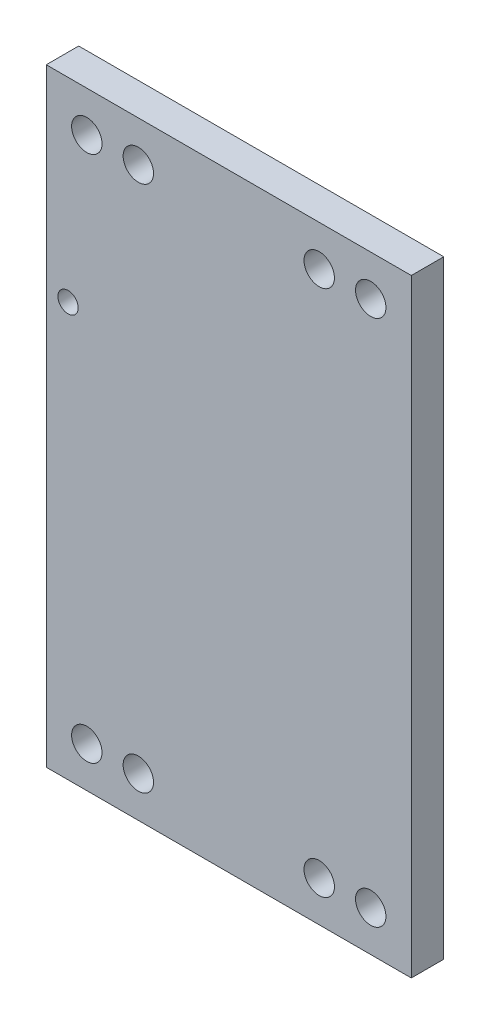
ISO-10303-21;
HEADER;
FILE_DESCRIPTION(('STEP AP214'),'2;1');
FILE_NAME('part.step','',(''),(''),'','','');
FILE_SCHEMA(('AUTOMOTIVE_DESIGN { 1 0 10303 214 1 1 1 1 }'));
ENDSEC;
DATA;
#1=APPLICATION_CONTEXT('core data for automotive mechanical design processes');
#2=APPLICATION_PROTOCOL_DEFINITION('international standard','automotive_design',2000,#1);
#3=PRODUCT_CONTEXT('',#1,'mechanical');
#4=PRODUCT('Part','Part','',(#3));
#5=PRODUCT_RELATED_PRODUCT_CATEGORY('part','',(#4));
#6=PRODUCT_DEFINITION_FORMATION('','',#4);
#7=PRODUCT_DEFINITION_CONTEXT('part definition',#1,'design');
#8=PRODUCT_DEFINITION('design','',#6,#7);
#9=PRODUCT_DEFINITION_SHAPE('','',#8);
#10=(LENGTH_UNIT() NAMED_UNIT(*) SI_UNIT(.MILLI.,.METRE.));
#11=(NAMED_UNIT(*) PLANE_ANGLE_UNIT() SI_UNIT($,.RADIAN.));
#12=(NAMED_UNIT(*) SI_UNIT($,.STERADIAN.) SOLID_ANGLE_UNIT());
#13=UNCERTAINTY_MEASURE_WITH_UNIT(LENGTH_MEASURE(1.E-05),#10,'distance_accuracy_value','');
#14=(GEOMETRIC_REPRESENTATION_CONTEXT(3) GLOBAL_UNCERTAINTY_ASSIGNED_CONTEXT((#13)) GLOBAL_UNIT_ASSIGNED_CONTEXT((#10,
#11,#12)) REPRESENTATION_CONTEXT('',''));
#15=CARTESIAN_POINT('',(0.,0.,0.));
#16=DIRECTION('',(0.,0.,1.));
#17=DIRECTION('',(1.,0.,0.));
#18=AXIS2_PLACEMENT_3D('',#15,#16,#17);
#19=CARTESIAN_POINT('',(9.,-15.,1.6));
#20=DIRECTION('',(0.,0.,-1.));
#21=DIRECTION('',(-1.,0.,0.));
#22=AXIS2_PLACEMENT_3D('',#19,#20,#21);
#23=PLANE('',#22);
#24=CARTESIAN_POINT('',(2.,-2.,1.6));
#25=DIRECTION('',(0.,0.,1.));
#26=DIRECTION('',(1.,0.,0.));
#27=AXIS2_PLACEMENT_3D('',#24,#25,#26);
#28=CIRCLE('',#27,0.75);
#29=CARTESIAN_POINT('',(2.75,-2.,1.6));
#30=VERTEX_POINT('',#29);
#31=EDGE_CURVE('E105',#30,#30,#28,.F.);
#32=ORIENTED_EDGE('',*,*,#31,.T.);
#33=EDGE_LOOP('',(#32));
#34=FACE_BOUND('',#33,.T.);
#35=CARTESIAN_POINT('',(4.54,-2.,1.6));
#36=DIRECTION('',(0.,0.,1.));
#37=DIRECTION('',(1.,0.,0.));
#38=AXIS2_PLACEMENT_3D('',#35,#36,#37);
#39=CIRCLE('',#38,0.75);
#40=CARTESIAN_POINT('',(5.29,-2.,1.6));
#41=VERTEX_POINT('',#40);
#42=EDGE_CURVE('E109',#41,#41,#39,.F.);
#43=ORIENTED_EDGE('',*,*,#42,.T.);
#44=EDGE_LOOP('',(#43));
#45=FACE_BOUND('',#44,.T.);
#46=CARTESIAN_POINT('',(1.075,-9.6,1.6));
#47=DIRECTION('',(0.,0.,1.));
#48=DIRECTION('',(1.,0.,0.));
#49=AXIS2_PLACEMENT_3D('',#46,#47,#48);
#50=CIRCLE('',#49,0.5);
#51=CARTESIAN_POINT('',(1.575,-9.6,1.6));
#52=VERTEX_POINT('',#51);
#53=EDGE_CURVE('E112',#52,#52,#50,.F.);
#54=ORIENTED_EDGE('',*,*,#53,.T.);
#55=EDGE_LOOP('',(#54));
#56=FACE_BOUND('',#55,.T.);
#57=CARTESIAN_POINT('',(13.46,-2.,1.6));
#58=DIRECTION('',(0.,0.,1.));
#59=DIRECTION('',(1.,0.,0.));
#60=AXIS2_PLACEMENT_3D('',#57,#58,#59);
#61=CIRCLE('',#60,0.75);
#62=CARTESIAN_POINT('',(14.21,-2.,1.6));
#63=VERTEX_POINT('',#62);
#64=EDGE_CURVE('E115',#63,#63,#61,.F.);
#65=ORIENTED_EDGE('',*,*,#64,.T.);
#66=EDGE_LOOP('',(#65));
#67=FACE_BOUND('',#66,.T.);
#68=CARTESIAN_POINT('',(16.,-2.,1.6));
#69=DIRECTION('',(0.,0.,1.));
#70=DIRECTION('',(1.,0.,0.));
#71=AXIS2_PLACEMENT_3D('',#68,#69,#70);
#72=CIRCLE('',#71,0.75);
#73=CARTESIAN_POINT('',(16.75,-2.,1.6));
#74=VERTEX_POINT('',#73);
#75=EDGE_CURVE('E118',#74,#74,#72,.F.);
#76=ORIENTED_EDGE('',*,*,#75,.T.);
#77=EDGE_LOOP('',(#76));
#78=FACE_BOUND('',#77,.T.);
#79=CARTESIAN_POINT('',(2.,-28.,1.6));
#80=DIRECTION('',(0.,0.,1.));
#81=DIRECTION('',(1.,0.,0.));
#82=AXIS2_PLACEMENT_3D('',#79,#80,#81);
#83=CIRCLE('',#82,0.75);
#84=CARTESIAN_POINT('',(2.75,-28.,1.6));
#85=VERTEX_POINT('',#84);
#86=EDGE_CURVE('E121',#85,#85,#83,.F.);
#87=ORIENTED_EDGE('',*,*,#86,.T.);
#88=EDGE_LOOP('',(#87));
#89=FACE_BOUND('',#88,.T.);
#90=CARTESIAN_POINT('',(4.54,-28.,1.6));
#91=DIRECTION('',(0.,0.,1.));
#92=DIRECTION('',(1.,0.,0.));
#93=AXIS2_PLACEMENT_3D('',#90,#91,#92);
#94=CIRCLE('',#93,0.75);
#95=CARTESIAN_POINT('',(5.29,-28.,1.6));
#96=VERTEX_POINT('',#95);
#97=EDGE_CURVE('E124',#96,#96,#94,.F.);
#98=ORIENTED_EDGE('',*,*,#97,.T.);
#99=EDGE_LOOP('',(#98));
#100=FACE_BOUND('',#99,.T.);
#101=CARTESIAN_POINT('',(13.46,-28.,1.6));
#102=DIRECTION('',(0.,0.,1.));
#103=DIRECTION('',(1.,0.,0.));
#104=AXIS2_PLACEMENT_3D('',#101,#102,#103);
#105=CIRCLE('',#104,0.75);
#106=CARTESIAN_POINT('',(14.21,-28.,1.6));
#107=VERTEX_POINT('',#106);
#108=EDGE_CURVE('E126',#107,#107,#105,.F.);
#109=ORIENTED_EDGE('',*,*,#108,.T.);
#110=EDGE_LOOP('',(#109));
#111=FACE_BOUND('',#110,.T.);
#112=CARTESIAN_POINT('',(16.,-28.,1.6));
#113=DIRECTION('',(0.,0.,1.));
#114=DIRECTION('',(1.,0.,0.));
#115=AXIS2_PLACEMENT_3D('',#112,#113,#114);
#116=CIRCLE('',#115,0.75);
#117=CARTESIAN_POINT('',(16.75,-28.,1.6));
#118=VERTEX_POINT('',#117);
#119=EDGE_CURVE('E20',#118,#118,#116,.F.);
#120=ORIENTED_EDGE('',*,*,#119,.T.);
#121=EDGE_LOOP('',(#120));
#122=FACE_BOUND('',#121,.T.);
#123=DIRECTION('',(1.,0.,0.));
#124=VECTOR('',#123,1.);
#125=CARTESIAN_POINT('',(18.,-30.,1.6));
#126=LINE('',#125,#124);
#127=CARTESIAN_POINT('',(18.,-30.,1.6));
#128=VERTEX_POINT('',#127);
#129=CARTESIAN_POINT('',(0.,-30.,1.6));
#130=VERTEX_POINT('',#129);
#131=EDGE_CURVE('E133',#128,#130,#126,.F.);
#132=ORIENTED_EDGE('',*,*,#131,.F.);
#133=DIRECTION('',(0.,1.,0.));
#134=VECTOR('',#133,1.);
#135=CARTESIAN_POINT('',(18.,0.,1.6));
#136=LINE('',#135,#134);
#137=CARTESIAN_POINT('',(18.,0.,1.6));
#138=VERTEX_POINT('',#137);
#139=EDGE_CURVE('E70',#138,#128,#136,.F.);
#140=ORIENTED_EDGE('',*,*,#139,.F.);
#141=DIRECTION('',(1.,0.,0.));
#142=VECTOR('',#141,1.);
#143=CARTESIAN_POINT('',(0.,0.,1.6));
#144=LINE('',#143,#142);
#145=CARTESIAN_POINT('',(0.,0.,1.6));
#146=VERTEX_POINT('',#145);
#147=EDGE_CURVE('E55',#146,#138,#144,.T.);
#148=ORIENTED_EDGE('',*,*,#147,.F.);
#149=DIRECTION('',(0.,1.,0.));
#150=VECTOR('',#149,1.);
#151=CARTESIAN_POINT('',(0.,-30.,1.6));
#152=LINE('',#151,#150);
#153=EDGE_CURVE('E60',#130,#146,#152,.T.);
#154=ORIENTED_EDGE('',*,*,#153,.F.);
#155=EDGE_LOOP('',(#132,#140,#148,#154));
#156=FACE_BOUND('',#155,.T.);
#157=ADVANCED_FACE('F17',(#34,#45,#56,#67,#78,#89,#100,#111,#122,#156),#23,.F.);
#158=CARTESIAN_POINT('',(0.,-30.,0.));
#159=DIRECTION('',(-1.,0.,0.));
#160=DIRECTION('',(0.,0.,1.));
#161=AXIS2_PLACEMENT_3D('',#158,#159,#160);
#162=PLANE('',#161);
#163=DIRECTION('',(0.,0.,1.));
#164=VECTOR('',#163,1.);
#165=CARTESIAN_POINT('',(0.,0.,0.));
#166=LINE('',#165,#164);
#167=CARTESIAN_POINT('',(0.,0.,0.));
#168=VERTEX_POINT('',#167);
#169=EDGE_CURVE('E62',#168,#146,#166,.T.);
#170=ORIENTED_EDGE('',*,*,#169,.F.);
#171=DIRECTION('',(0.,1.,0.));
#172=VECTOR('',#171,1.);
#173=CARTESIAN_POINT('',(0.,-15.,0.));
#174=LINE('',#173,#172);
#175=CARTESIAN_POINT('',(0.,-30.,0.));
#176=VERTEX_POINT('',#175);
#177=EDGE_CURVE('E108',#176,#168,#174,.T.);
#178=ORIENTED_EDGE('',*,*,#177,.F.);
#179=DIRECTION('',(0.,0.,-1.));
#180=VECTOR('',#179,1.);
#181=CARTESIAN_POINT('',(0.,-30.,0.));
#182=LINE('',#181,#180);
#183=EDGE_CURVE('E65',#130,#176,#182,.T.);
#184=ORIENTED_EDGE('',*,*,#183,.F.);
#185=ORIENTED_EDGE('',*,*,#153,.T.);
#186=EDGE_LOOP('',(#170,#178,#184,#185));
#187=FACE_BOUND('',#186,.T.);
#188=ADVANCED_FACE('F61',(#187),#162,.T.);
#189=CARTESIAN_POINT('',(0.,0.,0.));
#190=DIRECTION('',(0.,1.,0.));
#191=DIRECTION('',(0.,0.,1.));
#192=AXIS2_PLACEMENT_3D('',#189,#190,#191);
#193=PLANE('',#192);
#194=DIRECTION('',(0.,0.,-1.));
#195=VECTOR('',#194,1.);
#196=CARTESIAN_POINT('',(18.,0.,0.));
#197=LINE('',#196,#195);
#198=CARTESIAN_POINT('',(18.,0.,0.));
#199=VERTEX_POINT('',#198);
#200=EDGE_CURVE('E72',#199,#138,#197,.F.);
#201=ORIENTED_EDGE('',*,*,#200,.F.);
#202=DIRECTION('',(-1.,0.,0.));
#203=VECTOR('',#202,1.);
#204=CARTESIAN_POINT('',(9.,0.,0.));
#205=LINE('',#204,#203);
#206=EDGE_CURVE('E76',#168,#199,#205,.F.);
#207=ORIENTED_EDGE('',*,*,#206,.F.);
#208=ORIENTED_EDGE('',*,*,#169,.T.);
#209=ORIENTED_EDGE('',*,*,#147,.T.);
#210=EDGE_LOOP('',(#201,#207,#208,#209));
#211=FACE_BOUND('',#210,.T.);
#212=ADVANCED_FACE('F74',(#211),#193,.T.);
#213=CARTESIAN_POINT('',(18.,0.,0.));
#214=DIRECTION('',(1.,0.,0.));
#215=DIRECTION('',(0.,0.,-1.));
#216=AXIS2_PLACEMENT_3D('',#213,#214,#215);
#217=PLANE('',#216);
#218=DIRECTION('',(0.,0.,-1.));
#219=VECTOR('',#218,1.);
#220=CARTESIAN_POINT('',(18.,-30.,0.));
#221=LINE('',#220,#219);
#222=CARTESIAN_POINT('',(18.,-30.,0.));
#223=VERTEX_POINT('',#222);
#224=EDGE_CURVE('E35',#223,#128,#221,.F.);
#225=ORIENTED_EDGE('',*,*,#224,.F.);
#226=DIRECTION('',(0.,1.,0.));
#227=VECTOR('',#226,1.);
#228=CARTESIAN_POINT('',(18.,-15.,0.));
#229=LINE('',#228,#227);
#230=EDGE_CURVE('E144',#199,#223,#229,.F.);
#231=ORIENTED_EDGE('',*,*,#230,.F.);
#232=ORIENTED_EDGE('',*,*,#200,.T.);
#233=ORIENTED_EDGE('',*,*,#139,.T.);
#234=EDGE_LOOP('',(#225,#231,#232,#233));
#235=FACE_BOUND('',#234,.T.);
#236=ADVANCED_FACE('F142',(#235),#217,.T.);
#237=CARTESIAN_POINT('',(18.,-30.,0.));
#238=DIRECTION('',(0.,-1.,0.));
#239=DIRECTION('',(0.,0.,-1.));
#240=AXIS2_PLACEMENT_3D('',#237,#238,#239);
#241=PLANE('',#240);
#242=ORIENTED_EDGE('',*,*,#183,.T.);
#243=DIRECTION('',(-1.,0.,0.));
#244=VECTOR('',#243,1.);
#245=CARTESIAN_POINT('',(9.,-30.,0.));
#246=LINE('',#245,#244);
#247=EDGE_CURVE('E104',#223,#176,#246,.T.);
#248=ORIENTED_EDGE('',*,*,#247,.F.);
#249=ORIENTED_EDGE('',*,*,#224,.T.);
#250=ORIENTED_EDGE('',*,*,#131,.T.);
#251=EDGE_LOOP('',(#242,#248,#249,#250));
#252=FACE_BOUND('',#251,.T.);
#253=ADVANCED_FACE('F149',(#252),#241,.T.);
#254=CARTESIAN_POINT('',(16.,-28.,-0.8));
#255=DIRECTION('',(0.,0.,1.));
#256=DIRECTION('',(1.,0.,0.));
#257=AXIS2_PLACEMENT_3D('',#254,#255,#256);
#258=CYLINDRICAL_SURFACE('',#257,0.75);
#259=ORIENTED_EDGE('',*,*,#119,.F.);
#260=EDGE_LOOP('',(#259));
#261=FACE_BOUND('',#260,.T.);
#262=CARTESIAN_POINT('',(16.,-28.,0.));
#263=DIRECTION('',(0.,0.,1.));
#264=DIRECTION('',(1.,0.,0.));
#265=AXIS2_PLACEMENT_3D('',#262,#263,#264);
#266=CIRCLE('',#265,0.75);
#267=CARTESIAN_POINT('',(16.75,-28.,0.));
#268=VERTEX_POINT('',#267);
#269=EDGE_CURVE('E101',#268,#268,#266,.T.);
#270=ORIENTED_EDGE('',*,*,#269,.F.);
#271=EDGE_LOOP('',(#270));
#272=FACE_BOUND('',#271,.T.);
#273=ADVANCED_FACE('F151',(#261,#272),#258,.F.);
#274=CARTESIAN_POINT('',(13.46,-28.,-0.8));
#275=DIRECTION('',(0.,0.,1.));
#276=DIRECTION('',(1.,0.,0.));
#277=AXIS2_PLACEMENT_3D('',#274,#275,#276);
#278=CYLINDRICAL_SURFACE('',#277,0.75);
#279=ORIENTED_EDGE('',*,*,#108,.F.);
#280=EDGE_LOOP('',(#279));
#281=FACE_BOUND('',#280,.T.);
#282=CARTESIAN_POINT('',(13.46,-28.,0.));
#283=DIRECTION('',(0.,0.,1.));
#284=DIRECTION('',(1.,0.,0.));
#285=AXIS2_PLACEMENT_3D('',#282,#283,#284);
#286=CIRCLE('',#285,0.75);
#287=CARTESIAN_POINT('',(14.21,-28.,0.));
#288=VERTEX_POINT('',#287);
#289=EDGE_CURVE('E98',#288,#288,#286,.T.);
#290=ORIENTED_EDGE('',*,*,#289,.F.);
#291=EDGE_LOOP('',(#290));
#292=FACE_BOUND('',#291,.T.);
#293=ADVANCED_FACE('F158',(#281,#292),#278,.F.);
#294=CARTESIAN_POINT('',(4.54,-28.,-0.8));
#295=DIRECTION('',(0.,0.,1.));
#296=DIRECTION('',(1.,0.,0.));
#297=AXIS2_PLACEMENT_3D('',#294,#295,#296);
#298=CYLINDRICAL_SURFACE('',#297,0.75);
#299=ORIENTED_EDGE('',*,*,#97,.F.);
#300=EDGE_LOOP('',(#299));
#301=FACE_BOUND('',#300,.T.);
#302=CARTESIAN_POINT('',(4.54,-28.,0.));
#303=DIRECTION('',(0.,0.,1.));
#304=DIRECTION('',(1.,0.,0.));
#305=AXIS2_PLACEMENT_3D('',#302,#303,#304);
#306=CIRCLE('',#305,0.75);
#307=CARTESIAN_POINT('',(5.29,-28.,0.));
#308=VERTEX_POINT('',#307);
#309=EDGE_CURVE('E95',#308,#308,#306,.T.);
#310=ORIENTED_EDGE('',*,*,#309,.F.);
#311=EDGE_LOOP('',(#310));
#312=FACE_BOUND('',#311,.T.);
#313=ADVANCED_FACE('F192',(#301,#312),#298,.F.);
#314=CARTESIAN_POINT('',(2.,-28.,-0.8));
#315=DIRECTION('',(0.,0.,1.));
#316=DIRECTION('',(1.,0.,0.));
#317=AXIS2_PLACEMENT_3D('',#314,#315,#316);
#318=CYLINDRICAL_SURFACE('',#317,0.75);
#319=ORIENTED_EDGE('',*,*,#86,.F.);
#320=EDGE_LOOP('',(#319));
#321=FACE_BOUND('',#320,.T.);
#322=CARTESIAN_POINT('',(2.,-28.,0.));
#323=DIRECTION('',(0.,0.,1.));
#324=DIRECTION('',(1.,0.,0.));
#325=AXIS2_PLACEMENT_3D('',#322,#323,#324);
#326=CIRCLE('',#325,0.75);
#327=CARTESIAN_POINT('',(2.75,-28.,0.));
#328=VERTEX_POINT('',#327);
#329=EDGE_CURVE('E92',#328,#328,#326,.T.);
#330=ORIENTED_EDGE('',*,*,#329,.F.);
#331=EDGE_LOOP('',(#330));
#332=FACE_BOUND('',#331,.T.);
#333=ADVANCED_FACE('F188',(#321,#332),#318,.F.);
#334=CARTESIAN_POINT('',(16.,-2.,-0.8));
#335=DIRECTION('',(0.,0.,1.));
#336=DIRECTION('',(1.,0.,0.));
#337=AXIS2_PLACEMENT_3D('',#334,#335,#336);
#338=CYLINDRICAL_SURFACE('',#337,0.75);
#339=ORIENTED_EDGE('',*,*,#75,.F.);
#340=EDGE_LOOP('',(#339));
#341=FACE_BOUND('',#340,.T.);
#342=CARTESIAN_POINT('',(16.,-2.,0.));
#343=DIRECTION('',(0.,0.,1.));
#344=DIRECTION('',(1.,0.,0.));
#345=AXIS2_PLACEMENT_3D('',#342,#343,#344);
#346=CIRCLE('',#345,0.75);
#347=CARTESIAN_POINT('',(16.75,-2.,0.));
#348=VERTEX_POINT('',#347);
#349=EDGE_CURVE('E89',#348,#348,#346,.T.);
#350=ORIENTED_EDGE('',*,*,#349,.F.);
#351=EDGE_LOOP('',(#350));
#352=FACE_BOUND('',#351,.T.);
#353=ADVANCED_FACE('F184',(#341,#352),#338,.F.);
#354=CARTESIAN_POINT('',(13.46,-2.,-0.8));
#355=DIRECTION('',(0.,0.,1.));
#356=DIRECTION('',(1.,0.,0.));
#357=AXIS2_PLACEMENT_3D('',#354,#355,#356);
#358=CYLINDRICAL_SURFACE('',#357,0.75);
#359=ORIENTED_EDGE('',*,*,#64,.F.);
#360=EDGE_LOOP('',(#359));
#361=FACE_BOUND('',#360,.T.);
#362=CARTESIAN_POINT('',(13.46,-2.,0.));
#363=DIRECTION('',(0.,0.,1.));
#364=DIRECTION('',(1.,0.,0.));
#365=AXIS2_PLACEMENT_3D('',#362,#363,#364);
#366=CIRCLE('',#365,0.75);
#367=CARTESIAN_POINT('',(14.21,-2.,0.));
#368=VERTEX_POINT('',#367);
#369=EDGE_CURVE('E86',#368,#368,#366,.T.);
#370=ORIENTED_EDGE('',*,*,#369,.F.);
#371=EDGE_LOOP('',(#370));
#372=FACE_BOUND('',#371,.T.);
#373=ADVANCED_FACE('F180',(#361,#372),#358,.F.);
#374=CARTESIAN_POINT('',(1.075,-9.6,-0.8));
#375=DIRECTION('',(0.,0.,1.));
#376=DIRECTION('',(1.,0.,0.));
#377=AXIS2_PLACEMENT_3D('',#374,#375,#376);
#378=CYLINDRICAL_SURFACE('',#377,0.5);
#379=ORIENTED_EDGE('',*,*,#53,.F.);
#380=EDGE_LOOP('',(#379));
#381=FACE_BOUND('',#380,.T.);
#382=CARTESIAN_POINT('',(1.075,-9.6,0.));
#383=DIRECTION('',(0.,0.,1.));
#384=DIRECTION('',(1.,0.,0.));
#385=AXIS2_PLACEMENT_3D('',#382,#383,#384);
#386=CIRCLE('',#385,0.5);
#387=CARTESIAN_POINT('',(1.575,-9.6,0.));
#388=VERTEX_POINT('',#387);
#389=EDGE_CURVE('E83',#388,#388,#386,.T.);
#390=ORIENTED_EDGE('',*,*,#389,.F.);
#391=EDGE_LOOP('',(#390));
#392=FACE_BOUND('',#391,.T.);
#393=ADVANCED_FACE('F176',(#381,#392),#378,.F.);
#394=CARTESIAN_POINT('',(4.54,-2.,-0.8));
#395=DIRECTION('',(0.,0.,1.));
#396=DIRECTION('',(1.,0.,0.));
#397=AXIS2_PLACEMENT_3D('',#394,#395,#396);
#398=CYLINDRICAL_SURFACE('',#397,0.75);
#399=ORIENTED_EDGE('',*,*,#42,.F.);
#400=EDGE_LOOP('',(#399));
#401=FACE_BOUND('',#400,.T.);
#402=CARTESIAN_POINT('',(4.54,-2.,0.));
#403=DIRECTION('',(0.,0.,1.));
#404=DIRECTION('',(1.,0.,0.));
#405=AXIS2_PLACEMENT_3D('',#402,#403,#404);
#406=CIRCLE('',#405,0.75);
#407=CARTESIAN_POINT('',(5.29,-2.,0.));
#408=VERTEX_POINT('',#407);
#409=EDGE_CURVE('E26',#408,#408,#406,.T.);
#410=ORIENTED_EDGE('',*,*,#409,.F.);
#411=EDGE_LOOP('',(#410));
#412=FACE_BOUND('',#411,.T.);
#413=ADVANCED_FACE('F169',(#401,#412),#398,.F.);
#414=CARTESIAN_POINT('',(2.,-2.,-0.8));
#415=DIRECTION('',(0.,0.,1.));
#416=DIRECTION('',(1.,0.,0.));
#417=AXIS2_PLACEMENT_3D('',#414,#415,#416);
#418=CYLINDRICAL_SURFACE('',#417,0.75);
#419=ORIENTED_EDGE('',*,*,#31,.F.);
#420=EDGE_LOOP('',(#419));
#421=FACE_BOUND('',#420,.T.);
#422=CARTESIAN_POINT('',(2.,-2.,0.));
#423=DIRECTION('',(0.,0.,1.));
#424=DIRECTION('',(1.,0.,0.));
#425=AXIS2_PLACEMENT_3D('',#422,#423,#424);
#426=CIRCLE('',#425,0.75);
#427=CARTESIAN_POINT('',(2.75,-2.,0.));
#428=VERTEX_POINT('',#427);
#429=EDGE_CURVE('E11',#428,#428,#426,.T.);
#430=ORIENTED_EDGE('',*,*,#429,.F.);
#431=EDGE_LOOP('',(#430));
#432=FACE_BOUND('',#431,.T.);
#433=ADVANCED_FACE('F163',(#421,#432),#418,.F.);
#434=CARTESIAN_POINT('',(9.,-15.,0.));
#435=DIRECTION('',(0.,0.,-1.));
#436=DIRECTION('',(-1.,0.,0.));
#437=AXIS2_PLACEMENT_3D('',#434,#435,#436);
#438=PLANE('',#437);
#439=ORIENTED_EDGE('',*,*,#429,.T.);
#440=EDGE_LOOP('',(#439));
#441=FACE_BOUND('',#440,.T.);
#442=ORIENTED_EDGE('',*,*,#409,.T.);
#443=EDGE_LOOP('',(#442));
#444=FACE_BOUND('',#443,.T.);
#445=ORIENTED_EDGE('',*,*,#389,.T.);
#446=EDGE_LOOP('',(#445));
#447=FACE_BOUND('',#446,.T.);
#448=ORIENTED_EDGE('',*,*,#369,.T.);
#449=EDGE_LOOP('',(#448));
#450=FACE_BOUND('',#449,.T.);
#451=ORIENTED_EDGE('',*,*,#349,.T.);
#452=EDGE_LOOP('',(#451));
#453=FACE_BOUND('',#452,.T.);
#454=ORIENTED_EDGE('',*,*,#329,.T.);
#455=EDGE_LOOP('',(#454));
#456=FACE_BOUND('',#455,.T.);
#457=ORIENTED_EDGE('',*,*,#309,.T.);
#458=EDGE_LOOP('',(#457));
#459=FACE_BOUND('',#458,.T.);
#460=ORIENTED_EDGE('',*,*,#289,.T.);
#461=EDGE_LOOP('',(#460));
#462=FACE_BOUND('',#461,.T.);
#463=ORIENTED_EDGE('',*,*,#269,.T.);
#464=EDGE_LOOP('',(#463));
#465=FACE_BOUND('',#464,.T.);
#466=ORIENTED_EDGE('',*,*,#230,.T.);
#467=ORIENTED_EDGE('',*,*,#247,.T.);
#468=ORIENTED_EDGE('',*,*,#177,.T.);
#469=ORIENTED_EDGE('',*,*,#206,.T.);
#470=EDGE_LOOP('',(#466,#467,#468,#469));
#471=FACE_BOUND('',#470,.T.);
#472=ADVANCED_FACE('F147',(#441,#444,#447,#450,#453,#456,#459,#462,#465,#471),#438,.T.);
#473=CLOSED_SHELL('',(#157,#188,#212,#236,#253,#273,#293,#313,#333,#353,#373,#393,#413,#433,#472));
#474=MANIFOLD_SOLID_BREP('B1',#473);
#475=ADVANCED_BREP_SHAPE_REPRESENTATION('',(#18,#474),#14);
#476=SHAPE_DEFINITION_REPRESENTATION(#9,#475);
ENDSEC;
END-ISO-10303-21;
